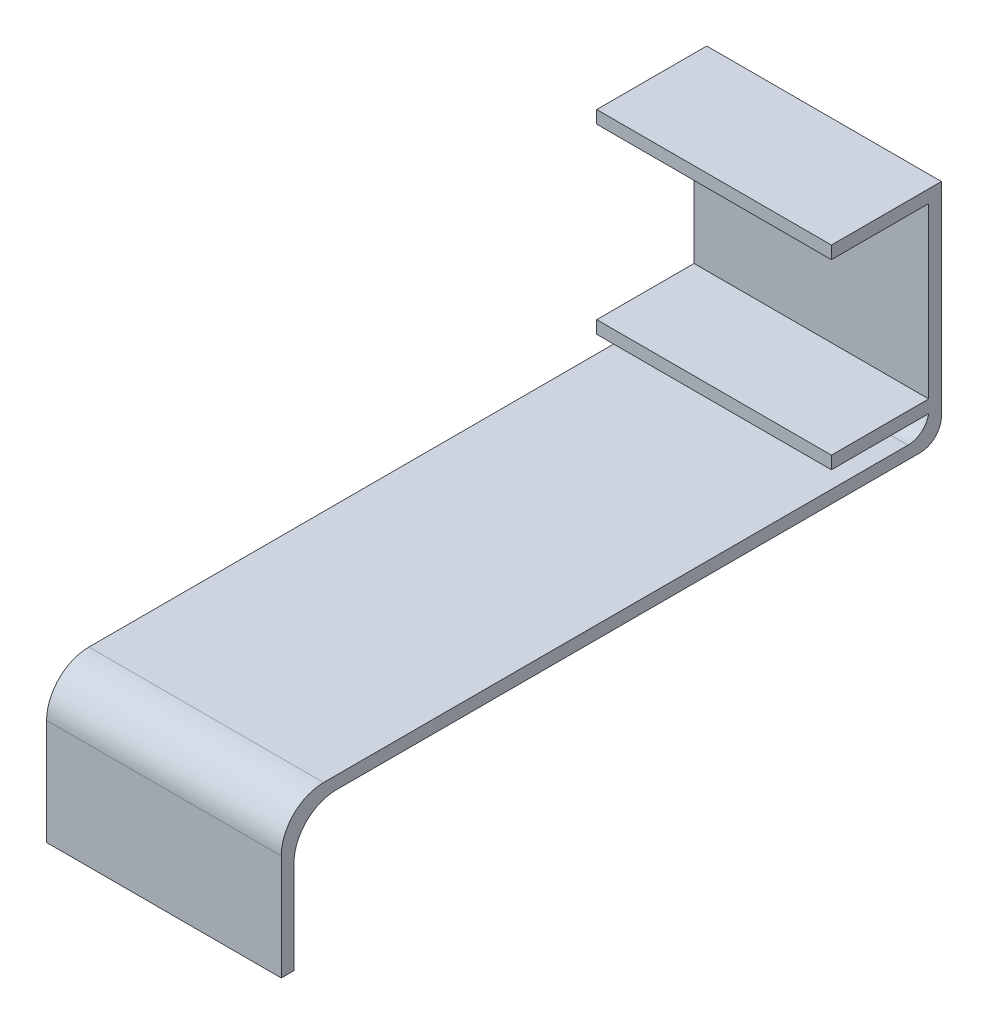
ISO-10303-21;
HEADER;
FILE_DESCRIPTION(('STEP AP214'),'2;1');
FILE_NAME('part.step','',(''),(''),'','','');
FILE_SCHEMA(('AUTOMOTIVE_DESIGN { 1 0 10303 214 1 1 1 1 }'));
ENDSEC;
DATA;
#1=APPLICATION_CONTEXT('core data for automotive mechanical design processes');
#2=APPLICATION_PROTOCOL_DEFINITION('international standard','automotive_design',2000,#1);
#3=PRODUCT_CONTEXT('',#1,'mechanical');
#4=PRODUCT('Part','Part','',(#3));
#5=PRODUCT_RELATED_PRODUCT_CATEGORY('part','',(#4));
#6=PRODUCT_DEFINITION_FORMATION('','',#4);
#7=PRODUCT_DEFINITION_CONTEXT('part definition',#1,'design');
#8=PRODUCT_DEFINITION('design','',#6,#7);
#9=PRODUCT_DEFINITION_SHAPE('','',#8);
#10=(LENGTH_UNIT() NAMED_UNIT(*) SI_UNIT(.MILLI.,.METRE.));
#11=(NAMED_UNIT(*) PLANE_ANGLE_UNIT() SI_UNIT($,.RADIAN.));
#12=(NAMED_UNIT(*) SI_UNIT($,.STERADIAN.) SOLID_ANGLE_UNIT());
#13=UNCERTAINTY_MEASURE_WITH_UNIT(LENGTH_MEASURE(1.E-05),#10,'distance_accuracy_value','');
#14=(GEOMETRIC_REPRESENTATION_CONTEXT(3) GLOBAL_UNCERTAINTY_ASSIGNED_CONTEXT((#13)) GLOBAL_UNIT_ASSIGNED_CONTEXT((#10,
#11,#12)) REPRESENTATION_CONTEXT('',''));
#15=CARTESIAN_POINT('',(0.,0.,0.));
#16=DIRECTION('',(0.,0.,1.));
#17=DIRECTION('',(1.,0.,0.));
#18=AXIS2_PLACEMENT_3D('',#15,#16,#17);
#19=CARTESIAN_POINT('',(0.,0.,3.));
#20=DIRECTION('',(0.,0.,1.));
#21=DIRECTION('',(1.,0.,0.));
#22=AXIS2_PLACEMENT_3D('',#19,#20,#21);
#23=PLANE('',#22);
#24=DIRECTION('',(0.,-1.,0.));
#25=VECTOR('',#24,1.);
#26=CARTESIAN_POINT('',(-27.730505642429,26.5,3.));
#27=LINE('',#26,#25);
#28=CARTESIAN_POINT('',(-27.730505642429,23.5,3.));
#29=VERTEX_POINT('',#28);
#30=CARTESIAN_POINT('',(-27.730505642429,-16.5,3.));
#31=VERTEX_POINT('',#30);
#32=EDGE_CURVE('E241',#29,#31,#27,.T.);
#33=ORIENTED_EDGE('',*,*,#32,.T.);
#34=DIRECTION('',(-1.,0.,0.));
#35=VECTOR('',#34,1.);
#36=CARTESIAN_POINT('',(-27.730505642429,-16.5,3.));
#37=LINE('',#36,#35);
#38=CARTESIAN_POINT('',(27.730505642429,-16.5,3.));
#39=VERTEX_POINT('',#38);
#40=EDGE_CURVE('E200',#39,#31,#37,.T.);
#41=ORIENTED_EDGE('',*,*,#40,.F.);
#42=DIRECTION('',(0.,1.,0.));
#43=VECTOR('',#42,1.);
#44=CARTESIAN_POINT('',(27.730505642429,26.5,3.));
#45=LINE('',#44,#43);
#46=CARTESIAN_POINT('',(27.730505642429,23.5,3.));
#47=VERTEX_POINT('',#46);
#48=EDGE_CURVE('E239',#39,#47,#45,.T.);
#49=ORIENTED_EDGE('',*,*,#48,.T.);
#50=DIRECTION('',(1.,0.,0.));
#51=VECTOR('',#50,1.);
#52=CARTESIAN_POINT('',(-27.730505642429,23.5,3.));
#53=LINE('',#52,#51);
#54=EDGE_CURVE('E218',#29,#47,#53,.T.);
#55=ORIENTED_EDGE('',*,*,#54,.F.);
#56=EDGE_LOOP('',(#33,#41,#49,#55));
#57=FACE_BOUND('',#56,.T.);
#58=ADVANCED_FACE('F36',(#57),#23,.T.);
#59=CARTESIAN_POINT('',(27.730505642429,26.5,3.));
#60=DIRECTION('',(-1.,0.,0.));
#61=DIRECTION('',(0.,-1.,0.));
#62=AXIS2_PLACEMENT_3D('',#59,#60,#61);
#63=PLANE('',#62);
#64=DIRECTION('',(0.,0.,-1.));
#65=VECTOR('',#64,1.);
#66=CARTESIAN_POINT('',(27.730505642429,-26.5,3.));
#67=LINE('',#66,#65);
#68=CARTESIAN_POINT('',(27.730505642429,-26.5,143.));
#69=VERTEX_POINT('',#68);
#70=CARTESIAN_POINT('',(27.730505642429,-26.5,5.));
#71=VERTEX_POINT('',#70);
#72=EDGE_CURVE('E245',#69,#71,#67,.T.);
#73=ORIENTED_EDGE('',*,*,#72,.T.);
#74=CARTESIAN_POINT('',(27.730505642429,-21.5,5.));
#75=DIRECTION('',(-1.,0.,0.));
#76=DIRECTION('',(0.,-1.,0.));
#77=AXIS2_PLACEMENT_3D('',#74,#75,#76);
#78=CIRCLE('',#77,5.);
#79=CARTESIAN_POINT('',(27.730505642429,-21.5,0.));
#80=VERTEX_POINT('',#79);
#81=EDGE_CURVE('E280',#71,#80,#78,.F.);
#82=ORIENTED_EDGE('',*,*,#81,.T.);
#83=DIRECTION('',(0.,1.,0.));
#84=VECTOR('',#83,1.);
#85=CARTESIAN_POINT('',(27.730505642429,26.5,0.));
#86=LINE('',#85,#84);
#87=CARTESIAN_POINT('',(27.730505642429,26.5,0.));
#88=VERTEX_POINT('',#87);
#89=EDGE_CURVE('E238',#80,#88,#86,.T.);
#90=ORIENTED_EDGE('',*,*,#89,.T.);
#91=DIRECTION('',(0.,0.,-1.));
#92=VECTOR('',#91,1.);
#93=CARTESIAN_POINT('',(27.730505642429,26.5,3.));
#94=LINE('',#93,#92);
#95=CARTESIAN_POINT('',(27.730505642429,26.5,26.));
#96=VERTEX_POINT('',#95);
#97=EDGE_CURVE('E258',#96,#88,#94,.T.);
#98=ORIENTED_EDGE('',*,*,#97,.F.);
#99=DIRECTION('',(0.,1.,0.));
#100=VECTOR('',#99,1.);
#101=CARTESIAN_POINT('',(27.730505642429,26.5,26.));
#102=LINE('',#101,#100);
#103=CARTESIAN_POINT('',(27.730505642429,23.5,26.));
#104=VERTEX_POINT('',#103);
#105=EDGE_CURVE('E224',#104,#96,#102,.T.);
#106=ORIENTED_EDGE('',*,*,#105,.F.);
#107=DIRECTION('',(0.,0.,-1.));
#108=VECTOR('',#107,1.);
#109=CARTESIAN_POINT('',(27.730505642429,23.5,26.));
#110=LINE('',#109,#108);
#111=EDGE_CURVE('E230',#104,#47,#110,.T.);
#112=ORIENTED_EDGE('',*,*,#111,.T.);
#113=ORIENTED_EDGE('',*,*,#48,.F.);
#114=DIRECTION('',(0.,0.,-1.));
#115=VECTOR('',#114,1.);
#116=CARTESIAN_POINT('',(27.730505642429,-16.5,26.));
#117=LINE('',#116,#115);
#118=CARTESIAN_POINT('',(27.730505642429,-16.5,26.));
#119=VERTEX_POINT('',#118);
#120=EDGE_CURVE('E211',#119,#39,#117,.T.);
#121=ORIENTED_EDGE('',*,*,#120,.F.);
#122=DIRECTION('',(0.,1.,0.));
#123=VECTOR('',#122,1.);
#124=CARTESIAN_POINT('',(27.730505642429,-16.5,26.));
#125=LINE('',#124,#123);
#126=CARTESIAN_POINT('',(27.730505642429,-19.5,26.));
#127=VERTEX_POINT('',#126);
#128=EDGE_CURVE('E202',#127,#119,#125,.T.);
#129=ORIENTED_EDGE('',*,*,#128,.F.);
#130=DIRECTION('',(0.,0.,-1.));
#131=VECTOR('',#130,1.);
#132=CARTESIAN_POINT('',(27.730505642429,-19.5,26.));
#133=LINE('',#132,#131);
#134=CARTESIAN_POINT('',(27.730505642429,-19.5,3.));
#135=VERTEX_POINT('',#134);
#136=EDGE_CURVE('E213',#127,#135,#133,.T.);
#137=ORIENTED_EDGE('',*,*,#136,.T.);
#138=CARTESIAN_POINT('',(27.730505642429,-18.5,7.89897948556635));
#139=DIRECTION('',(-1.,0.,0.));
#140=DIRECTION('',(0.,-1.,0.));
#141=AXIS2_PLACEMENT_3D('',#138,#139,#140);
#142=CIRCLE('',#141,5.);
#143=CARTESIAN_POINT('',(27.730505642429,-23.5,7.89897948556637));
#144=VERTEX_POINT('',#143);
#145=EDGE_CURVE('E11',#135,#144,#142,.T.);
#146=ORIENTED_EDGE('',*,*,#145,.T.);
#147=DIRECTION('',(0.,0.,-1.));
#148=VECTOR('',#147,1.);
#149=CARTESIAN_POINT('',(27.730505642429,-23.5,153.));
#150=LINE('',#149,#148);
#151=CARTESIAN_POINT('',(27.730505642429,-23.5,146.));
#152=VERTEX_POINT('',#151);
#153=EDGE_CURVE('E193',#152,#144,#150,.T.);
#154=ORIENTED_EDGE('',*,*,#153,.F.);
#155=CARTESIAN_POINT('',(27.730505642429,-33.5,146.));
#156=DIRECTION('',(-1.,0.,0.));
#157=DIRECTION('',(0.,-1.,0.));
#158=AXIS2_PLACEMENT_3D('',#155,#156,#157);
#159=CIRCLE('',#158,10.);
#160=CARTESIAN_POINT('',(27.730505642429,-33.5,156.));
#161=VERTEX_POINT('',#160);
#162=EDGE_CURVE('E275',#152,#161,#159,.F.);
#163=ORIENTED_EDGE('',*,*,#162,.T.);
#164=DIRECTION('',(0.,1.,0.));
#165=VECTOR('',#164,1.);
#166=CARTESIAN_POINT('',(27.730505642429,-23.5,156.));
#167=LINE('',#166,#165);
#168=CARTESIAN_POINT('',(27.730505642429,-58.5,156.));
#169=VERTEX_POINT('',#168);
#170=EDGE_CURVE('E165',#169,#161,#167,.T.);
#171=ORIENTED_EDGE('',*,*,#170,.F.);
#172=DIRECTION('',(0.,0.,-1.));
#173=VECTOR('',#172,1.);
#174=CARTESIAN_POINT('',(27.730505642429,-58.5,156.));
#175=LINE('',#174,#173);
#176=CARTESIAN_POINT('',(27.730505642429,-58.5,153.));
#177=VERTEX_POINT('',#176);
#178=EDGE_CURVE('E176',#169,#177,#175,.T.);
#179=ORIENTED_EDGE('',*,*,#178,.T.);
#180=DIRECTION('',(0.,1.,0.));
#181=VECTOR('',#180,1.);
#182=CARTESIAN_POINT('',(27.730505642429,-23.5,153.));
#183=LINE('',#182,#181);
#184=CARTESIAN_POINT('',(27.730505642429,-36.5,153.));
#185=VERTEX_POINT('',#184);
#186=EDGE_CURVE('E185',#177,#185,#183,.T.);
#187=ORIENTED_EDGE('',*,*,#186,.T.);
#188=CARTESIAN_POINT('',(27.730505642429,-36.5,143.));
#189=DIRECTION('',(-1.,0.,0.));
#190=DIRECTION('',(0.,-1.,0.));
#191=AXIS2_PLACEMENT_3D('',#188,#189,#190);
#192=CIRCLE('',#191,10.);
#193=EDGE_CURVE('E266',#185,#69,#192,.T.);
#194=ORIENTED_EDGE('',*,*,#193,.T.);
#195=EDGE_LOOP('',(#73,#82,#90,#98,#106,#112,#113,#121,#129,#137,#146,#154,#163,#171,#179,#187,#194));
#196=FACE_BOUND('',#195,.T.);
#197=ADVANCED_FACE('F297',(#196),#63,.F.);
#198=CARTESIAN_POINT('',(-27.730505642429,26.5,3.));
#199=DIRECTION('',(0.,-1.,0.));
#200=DIRECTION('',(0.,0.,-1.));
#201=AXIS2_PLACEMENT_3D('',#198,#199,#200);
#202=PLANE('',#201);
#203=DIRECTION('',(-1.,0.,0.));
#204=VECTOR('',#203,1.);
#205=CARTESIAN_POINT('',(-27.730505642429,26.5,0.));
#206=LINE('',#205,#204);
#207=CARTESIAN_POINT('',(-27.730505642429,26.5,0.));
#208=VERTEX_POINT('',#207);
#209=EDGE_CURVE('E247',#88,#208,#206,.T.);
#210=ORIENTED_EDGE('',*,*,#209,.T.);
#211=DIRECTION('',(0.,0.,-1.));
#212=VECTOR('',#211,1.);
#213=CARTESIAN_POINT('',(-27.730505642429,26.5,3.));
#214=LINE('',#213,#212);
#215=CARTESIAN_POINT('',(-27.730505642429,26.5,26.));
#216=VERTEX_POINT('',#215);
#217=EDGE_CURVE('E255',#216,#208,#214,.T.);
#218=ORIENTED_EDGE('',*,*,#217,.F.);
#219=DIRECTION('',(-1.,0.,0.));
#220=VECTOR('',#219,1.);
#221=CARTESIAN_POINT('',(-27.730505642429,26.5,26.));
#222=LINE('',#221,#220);
#223=EDGE_CURVE('E227',#96,#216,#222,.T.);
#224=ORIENTED_EDGE('',*,*,#223,.F.);
#225=ORIENTED_EDGE('',*,*,#97,.T.);
#226=EDGE_LOOP('',(#210,#218,#224,#225));
#227=FACE_BOUND('',#226,.T.);
#228=ADVANCED_FACE('F318',(#227),#202,.F.);
#229=CARTESIAN_POINT('',(-27.730505642429,26.5,3.));
#230=DIRECTION('',(1.,0.,0.));
#231=DIRECTION('',(0.,1.,0.));
#232=AXIS2_PLACEMENT_3D('',#229,#230,#231);
#233=PLANE('',#232);
#234=DIRECTION('',(0.,-1.,0.));
#235=VECTOR('',#234,1.);
#236=CARTESIAN_POINT('',(-27.730505642429,26.5,0.));
#237=LINE('',#236,#235);
#238=CARTESIAN_POINT('',(-27.730505642429,-21.5,0.));
#239=VERTEX_POINT('',#238);
#240=EDGE_CURVE('E242',#208,#239,#237,.T.);
#241=ORIENTED_EDGE('',*,*,#240,.T.);
#242=CARTESIAN_POINT('',(-27.730505642429,-21.5,5.));
#243=DIRECTION('',(1.,0.,0.));
#244=DIRECTION('',(0.,1.,0.));
#245=AXIS2_PLACEMENT_3D('',#242,#243,#244);
#246=CIRCLE('',#245,5.);
#247=CARTESIAN_POINT('',(-27.730505642429,-26.5,5.));
#248=VERTEX_POINT('',#247);
#249=EDGE_CURVE('E284',#239,#248,#246,.F.);
#250=ORIENTED_EDGE('',*,*,#249,.T.);
#251=DIRECTION('',(0.,0.,-1.));
#252=VECTOR('',#251,1.);
#253=CARTESIAN_POINT('',(-27.730505642429,-26.5,3.));
#254=LINE('',#253,#252);
#255=CARTESIAN_POINT('',(-27.730505642429,-26.5,143.));
#256=VERTEX_POINT('',#255);
#257=EDGE_CURVE('E252',#256,#248,#254,.T.);
#258=ORIENTED_EDGE('',*,*,#257,.F.);
#259=CARTESIAN_POINT('',(-27.730505642429,-36.5,143.));
#260=DIRECTION('',(1.,0.,0.));
#261=DIRECTION('',(0.,1.,0.));
#262=AXIS2_PLACEMENT_3D('',#259,#260,#261);
#263=CIRCLE('',#262,10.);
#264=CARTESIAN_POINT('',(-27.730505642429,-36.5,153.));
#265=VERTEX_POINT('',#264);
#266=EDGE_CURVE('E268',#256,#265,#263,.T.);
#267=ORIENTED_EDGE('',*,*,#266,.T.);
#268=DIRECTION('',(0.,-1.,0.));
#269=VECTOR('',#268,1.);
#270=CARTESIAN_POINT('',(-27.730505642429,-23.5,153.));
#271=LINE('',#270,#269);
#272=CARTESIAN_POINT('',(-27.730505642429,-58.5,153.));
#273=VERTEX_POINT('',#272);
#274=EDGE_CURVE('E172',#265,#273,#271,.T.);
#275=ORIENTED_EDGE('',*,*,#274,.T.);
#276=DIRECTION('',(0.,0.,-1.));
#277=VECTOR('',#276,1.);
#278=CARTESIAN_POINT('',(-27.730505642429,-58.5,156.));
#279=LINE('',#278,#277);
#280=CARTESIAN_POINT('',(-27.730505642429,-58.5,156.));
#281=VERTEX_POINT('',#280);
#282=EDGE_CURVE('E168',#281,#273,#279,.T.);
#283=ORIENTED_EDGE('',*,*,#282,.F.);
#284=DIRECTION('',(0.,-1.,0.));
#285=VECTOR('',#284,1.);
#286=CARTESIAN_POINT('',(-27.730505642429,-23.5,156.));
#287=LINE('',#286,#285);
#288=CARTESIAN_POINT('',(-27.730505642429,-33.5,156.));
#289=VERTEX_POINT('',#288);
#290=EDGE_CURVE('E155',#289,#281,#287,.T.);
#291=ORIENTED_EDGE('',*,*,#290,.F.);
#292=CARTESIAN_POINT('',(-27.730505642429,-33.5,146.));
#293=DIRECTION('',(1.,0.,0.));
#294=DIRECTION('',(0.,1.,0.));
#295=AXIS2_PLACEMENT_3D('',#292,#293,#294);
#296=CIRCLE('',#295,10.);
#297=CARTESIAN_POINT('',(-27.730505642429,-23.5,146.));
#298=VERTEX_POINT('',#297);
#299=EDGE_CURVE('E271',#289,#298,#296,.F.);
#300=ORIENTED_EDGE('',*,*,#299,.T.);
#301=DIRECTION('',(0.,0.,-1.));
#302=VECTOR('',#301,1.);
#303=CARTESIAN_POINT('',(-27.730505642429,-23.5,153.));
#304=LINE('',#303,#302);
#305=CARTESIAN_POINT('',(-27.730505642429,-23.5,7.89897948556637));
#306=VERTEX_POINT('',#305);
#307=EDGE_CURVE('E175',#298,#306,#304,.T.);
#308=ORIENTED_EDGE('',*,*,#307,.T.);
#309=CARTESIAN_POINT('',(-27.730505642429,-18.5,7.89897948556635));
#310=DIRECTION('',(1.,0.,0.));
#311=DIRECTION('',(0.,1.,0.));
#312=AXIS2_PLACEMENT_3D('',#309,#310,#311);
#313=CIRCLE('',#312,5.);
#314=CARTESIAN_POINT('',(-27.730505642429,-19.5,3.));
#315=VERTEX_POINT('',#314);
#316=EDGE_CURVE('E44',#306,#315,#313,.T.);
#317=ORIENTED_EDGE('',*,*,#316,.T.);
#318=DIRECTION('',(0.,0.,-1.));
#319=VECTOR('',#318,1.);
#320=CARTESIAN_POINT('',(-27.730505642429,-19.5,26.));
#321=LINE('',#320,#319);
#322=CARTESIAN_POINT('',(-27.730505642429,-19.5,26.));
#323=VERTEX_POINT('',#322);
#324=EDGE_CURVE('E215',#323,#315,#321,.T.);
#325=ORIENTED_EDGE('',*,*,#324,.F.);
#326=DIRECTION('',(0.,-1.,0.));
#327=VECTOR('',#326,1.);
#328=CARTESIAN_POINT('',(-27.730505642429,-16.5,26.));
#329=LINE('',#328,#327);
#330=CARTESIAN_POINT('',(-27.730505642429,-16.5,26.));
#331=VERTEX_POINT('',#330);
#332=EDGE_CURVE('E196',#331,#323,#329,.T.);
#333=ORIENTED_EDGE('',*,*,#332,.F.);
#334=DIRECTION('',(0.,0.,-1.));
#335=VECTOR('',#334,1.);
#336=CARTESIAN_POINT('',(-27.730505642429,-16.5,26.));
#337=LINE('',#336,#335);
#338=EDGE_CURVE('E206',#331,#31,#337,.T.);
#339=ORIENTED_EDGE('',*,*,#338,.T.);
#340=ORIENTED_EDGE('',*,*,#32,.F.);
#341=DIRECTION('',(0.,0.,-1.));
#342=VECTOR('',#341,1.);
#343=CARTESIAN_POINT('',(-27.730505642429,23.5,26.));
#344=LINE('',#343,#342);
#345=CARTESIAN_POINT('',(-27.730505642429,23.5,26.));
#346=VERTEX_POINT('',#345);
#347=EDGE_CURVE('E235',#346,#29,#344,.T.);
#348=ORIENTED_EDGE('',*,*,#347,.F.);
#349=DIRECTION('',(0.,-1.,0.));
#350=VECTOR('',#349,1.);
#351=CARTESIAN_POINT('',(-27.730505642429,26.5,26.));
#352=LINE('',#351,#350);
#353=EDGE_CURVE('E219',#216,#346,#352,.T.);
#354=ORIENTED_EDGE('',*,*,#353,.F.);
#355=ORIENTED_EDGE('',*,*,#217,.T.);
#356=EDGE_LOOP('',(#241,#250,#258,#267,#275,#283,#291,#300,#308,#317,#325,#333,#339,#340,#348,
#354,#355));
#357=FACE_BOUND('',#356,.T.);
#358=ADVANCED_FACE('F170',(#357),#233,.F.);
#359=CARTESIAN_POINT('',(-27.730505642429,-26.5,3.));
#360=DIRECTION('',(0.,1.,0.));
#361=DIRECTION('',(0.,0.,1.));
#362=AXIS2_PLACEMENT_3D('',#359,#360,#361);
#363=PLANE('',#362);
#364=ORIENTED_EDGE('',*,*,#257,.T.);
#365=DIRECTION('',(1.,0.,0.));
#366=VECTOR('',#365,1.);
#367=CARTESIAN_POINT('',(-27.730505642429,-26.5,5.));
#368=LINE('',#367,#366);
#369=EDGE_CURVE('E277',#248,#71,#368,.T.);
#370=ORIENTED_EDGE('',*,*,#369,.T.);
#371=ORIENTED_EDGE('',*,*,#72,.F.);
#372=DIRECTION('',(1.,0.,0.));
#373=VECTOR('',#372,1.);
#374=CARTESIAN_POINT('',(-27.730505642429,-26.5,143.));
#375=LINE('',#374,#373);
#376=EDGE_CURVE('E264',#69,#256,#375,.F.);
#377=ORIENTED_EDGE('',*,*,#376,.T.);
#378=EDGE_LOOP('',(#364,#370,#371,#377));
#379=FACE_BOUND('',#378,.T.);
#380=ADVANCED_FACE('F327',(#379),#363,.F.);
#381=CARTESIAN_POINT('',(0.,0.,0.));
#382=DIRECTION('',(0.,0.,1.));
#383=DIRECTION('',(1.,0.,0.));
#384=AXIS2_PLACEMENT_3D('',#381,#382,#383);
#385=PLANE('',#384);
#386=ORIENTED_EDGE('',*,*,#89,.F.);
#387=DIRECTION('',(1.,0.,0.));
#388=VECTOR('',#387,1.);
#389=CARTESIAN_POINT('',(0.,-21.5,0.));
#390=LINE('',#389,#388);
#391=EDGE_CURVE('E282',#80,#239,#390,.F.);
#392=ORIENTED_EDGE('',*,*,#391,.T.);
#393=ORIENTED_EDGE('',*,*,#240,.F.);
#394=ORIENTED_EDGE('',*,*,#209,.F.);
#395=EDGE_LOOP('',(#386,#392,#393,#394));
#396=FACE_BOUND('',#395,.T.);
#397=ADVANCED_FACE('F324',(#396),#385,.F.);
#398=CARTESIAN_POINT('',(-27.730505642429,23.5,26.));
#399=DIRECTION('',(0.,1.,0.));
#400=DIRECTION('',(0.,0.,1.));
#401=AXIS2_PLACEMENT_3D('',#398,#399,#400);
#402=PLANE('',#401);
#403=ORIENTED_EDGE('',*,*,#54,.T.);
#404=ORIENTED_EDGE('',*,*,#111,.F.);
#405=DIRECTION('',(1.,0.,0.));
#406=VECTOR('',#405,1.);
#407=CARTESIAN_POINT('',(-27.730505642429,23.5,26.));
#408=LINE('',#407,#406);
#409=EDGE_CURVE('E222',#346,#104,#408,.T.);
#410=ORIENTED_EDGE('',*,*,#409,.F.);
#411=ORIENTED_EDGE('',*,*,#347,.T.);
#412=EDGE_LOOP('',(#403,#404,#410,#411));
#413=FACE_BOUND('',#412,.T.);
#414=ADVANCED_FACE('F322',(#413),#402,.F.);
#415=CARTESIAN_POINT('',(0.,0.,26.));
#416=DIRECTION('',(0.,0.,1.));
#417=DIRECTION('',(1.,0.,0.));
#418=AXIS2_PLACEMENT_3D('',#415,#416,#417);
#419=PLANE('',#418);
#420=ORIENTED_EDGE('',*,*,#353,.T.);
#421=ORIENTED_EDGE('',*,*,#409,.T.);
#422=ORIENTED_EDGE('',*,*,#105,.T.);
#423=ORIENTED_EDGE('',*,*,#223,.T.);
#424=EDGE_LOOP('',(#420,#421,#422,#423));
#425=FACE_BOUND('',#424,.T.);
#426=ADVANCED_FACE('F356',(#425),#419,.T.);
#427=CARTESIAN_POINT('',(-27.730505642429,-19.5,26.));
#428=DIRECTION('',(0.,1.,0.));
#429=DIRECTION('',(0.,0.,1.));
#430=AXIS2_PLACEMENT_3D('',#427,#428,#429);
#431=PLANE('',#430);
#432=DIRECTION('',(1.,0.,0.));
#433=VECTOR('',#432,1.);
#434=CARTESIAN_POINT('',(-27.730505642429,-19.5,3.));
#435=LINE('',#434,#433);
#436=EDGE_CURVE('E195',#315,#135,#435,.T.);
#437=ORIENTED_EDGE('',*,*,#436,.T.);
#438=ORIENTED_EDGE('',*,*,#136,.F.);
#439=DIRECTION('',(1.,0.,0.));
#440=VECTOR('',#439,1.);
#441=CARTESIAN_POINT('',(-27.730505642429,-19.5,26.));
#442=LINE('',#441,#440);
#443=EDGE_CURVE('E199',#323,#127,#442,.T.);
#444=ORIENTED_EDGE('',*,*,#443,.F.);
#445=ORIENTED_EDGE('',*,*,#324,.T.);
#446=EDGE_LOOP('',(#437,#438,#444,#445));
#447=FACE_BOUND('',#446,.T.);
#448=ADVANCED_FACE('F291',(#447),#431,.F.);
#449=CARTESIAN_POINT('',(-27.730505642429,-16.5,26.));
#450=DIRECTION('',(0.,-1.,0.));
#451=DIRECTION('',(0.,0.,-1.));
#452=AXIS2_PLACEMENT_3D('',#449,#450,#451);
#453=PLANE('',#452);
#454=ORIENTED_EDGE('',*,*,#40,.T.);
#455=ORIENTED_EDGE('',*,*,#338,.F.);
#456=DIRECTION('',(-1.,0.,0.));
#457=VECTOR('',#456,1.);
#458=CARTESIAN_POINT('',(-27.730505642429,-16.5,26.));
#459=LINE('',#458,#457);
#460=EDGE_CURVE('E204',#119,#331,#459,.T.);
#461=ORIENTED_EDGE('',*,*,#460,.F.);
#462=ORIENTED_EDGE('',*,*,#120,.T.);
#463=EDGE_LOOP('',(#454,#455,#461,#462));
#464=FACE_BOUND('',#463,.T.);
#465=ADVANCED_FACE('F367',(#464),#453,.F.);
#466=CARTESIAN_POINT('',(0.,0.,26.));
#467=DIRECTION('',(0.,0.,1.));
#468=DIRECTION('',(1.,0.,0.));
#469=AXIS2_PLACEMENT_3D('',#466,#467,#468);
#470=PLANE('',#469);
#471=ORIENTED_EDGE('',*,*,#332,.T.);
#472=ORIENTED_EDGE('',*,*,#443,.T.);
#473=ORIENTED_EDGE('',*,*,#128,.T.);
#474=ORIENTED_EDGE('',*,*,#460,.T.);
#475=EDGE_LOOP('',(#471,#472,#473,#474));
#476=FACE_BOUND('',#475,.T.);
#477=ADVANCED_FACE('F369',(#476),#470,.T.);
#478=CARTESIAN_POINT('',(27.730505642429,-23.5,153.));
#479=DIRECTION('',(0.,-1.,0.));
#480=DIRECTION('',(1.,0.,0.));
#481=AXIS2_PLACEMENT_3D('',#478,#479,#480);
#482=PLANE('',#481);
#483=ORIENTED_EDGE('',*,*,#153,.T.);
#484=DIRECTION('',(-1.,0.,0.));
#485=VECTOR('',#484,1.);
#486=CARTESIAN_POINT('',(27.730505642429,-23.5,7.89897948556637));
#487=LINE('',#486,#485);
#488=EDGE_CURVE('E286',#144,#306,#487,.T.);
#489=ORIENTED_EDGE('',*,*,#488,.T.);
#490=ORIENTED_EDGE('',*,*,#307,.F.);
#491=DIRECTION('',(-1.,0.,0.));
#492=VECTOR('',#491,1.);
#493=CARTESIAN_POINT('',(27.730505642429,-23.5,146.));
#494=LINE('',#493,#492);
#495=EDGE_CURVE('E273',#298,#152,#494,.F.);
#496=ORIENTED_EDGE('',*,*,#495,.T.);
#497=EDGE_LOOP('',(#483,#489,#490,#496));
#498=FACE_BOUND('',#497,.T.);
#499=ADVANCED_FACE('F294',(#498),#482,.F.);
#500=CARTESIAN_POINT('',(27.730505642429,-58.5,156.));
#501=DIRECTION('',(0.,1.,0.));
#502=DIRECTION('',(0.,0.,1.));
#503=AXIS2_PLACEMENT_3D('',#500,#501,#502);
#504=PLANE('',#503);
#505=DIRECTION('',(1.,0.,0.));
#506=VECTOR('',#505,1.);
#507=CARTESIAN_POINT('',(27.730505642429,-58.5,153.));
#508=LINE('',#507,#506);
#509=EDGE_CURVE('E189',#273,#177,#508,.T.);
#510=ORIENTED_EDGE('',*,*,#509,.T.);
#511=ORIENTED_EDGE('',*,*,#178,.F.);
#512=DIRECTION('',(1.,0.,0.));
#513=VECTOR('',#512,1.);
#514=CARTESIAN_POINT('',(27.730505642429,-58.5,156.));
#515=LINE('',#514,#513);
#516=EDGE_CURVE('E160',#281,#169,#515,.T.);
#517=ORIENTED_EDGE('',*,*,#516,.F.);
#518=ORIENTED_EDGE('',*,*,#282,.T.);
#519=EDGE_LOOP('',(#510,#511,#517,#518));
#520=FACE_BOUND('',#519,.T.);
#521=ADVANCED_FACE('F178',(#520),#504,.F.);
#522=CARTESIAN_POINT('',(0.,0.,156.));
#523=DIRECTION('',(0.,0.,-1.));
#524=DIRECTION('',(-1.,0.,0.));
#525=AXIS2_PLACEMENT_3D('',#522,#523,#524);
#526=PLANE('',#525);
#527=ORIENTED_EDGE('',*,*,#170,.T.);
#528=DIRECTION('',(-1.,0.,0.));
#529=VECTOR('',#528,1.);
#530=CARTESIAN_POINT('',(0.,-33.5,156.));
#531=LINE('',#530,#529);
#532=EDGE_CURVE('E163',#161,#289,#531,.T.);
#533=ORIENTED_EDGE('',*,*,#532,.T.);
#534=ORIENTED_EDGE('',*,*,#290,.T.);
#535=ORIENTED_EDGE('',*,*,#516,.T.);
#536=EDGE_LOOP('',(#527,#533,#534,#535));
#537=FACE_BOUND('',#536,.T.);
#538=ADVANCED_FACE('F158',(#537),#526,.F.);
#539=CARTESIAN_POINT('',(0.,0.,153.));
#540=DIRECTION('',(0.,0.,-1.));
#541=DIRECTION('',(-1.,0.,0.));
#542=AXIS2_PLACEMENT_3D('',#539,#540,#541);
#543=PLANE('',#542);
#544=ORIENTED_EDGE('',*,*,#274,.F.);
#545=DIRECTION('',(1.,0.,0.));
#546=VECTOR('',#545,1.);
#547=CARTESIAN_POINT('',(0.,-36.5,153.));
#548=LINE('',#547,#546);
#549=EDGE_CURVE('E261',#265,#185,#548,.T.);
#550=ORIENTED_EDGE('',*,*,#549,.T.);
#551=ORIENTED_EDGE('',*,*,#186,.F.);
#552=ORIENTED_EDGE('',*,*,#509,.F.);
#553=EDGE_LOOP('',(#544,#550,#551,#552));
#554=FACE_BOUND('',#553,.T.);
#555=ADVANCED_FACE('F309',(#554),#543,.T.);
#556=CARTESIAN_POINT('',(0.,-36.5,143.));
#557=DIRECTION('',(1.,0.,0.));
#558=DIRECTION('',(0.,0.,-1.));
#559=AXIS2_PLACEMENT_3D('',#556,#557,#558);
#560=CYLINDRICAL_SURFACE('',#559,10.);
#561=ORIENTED_EDGE('',*,*,#266,.F.);
#562=ORIENTED_EDGE('',*,*,#376,.F.);
#563=ORIENTED_EDGE('',*,*,#193,.F.);
#564=ORIENTED_EDGE('',*,*,#549,.F.);
#565=EDGE_LOOP('',(#561,#562,#563,#564));
#566=FACE_BOUND('',#565,.T.);
#567=ADVANCED_FACE('F302',(#566),#560,.F.);
#568=CARTESIAN_POINT('',(0.,-33.5,146.));
#569=DIRECTION('',(-1.,0.,0.));
#570=DIRECTION('',(0.,-1.,0.));
#571=AXIS2_PLACEMENT_3D('',#568,#569,#570);
#572=CYLINDRICAL_SURFACE('',#571,10.);
#573=ORIENTED_EDGE('',*,*,#162,.F.);
#574=ORIENTED_EDGE('',*,*,#495,.F.);
#575=ORIENTED_EDGE('',*,*,#299,.F.);
#576=ORIENTED_EDGE('',*,*,#532,.F.);
#577=EDGE_LOOP('',(#573,#574,#575,#576));
#578=FACE_BOUND('',#577,.T.);
#579=ADVANCED_FACE('F299',(#578),#572,.T.);
#580=CARTESIAN_POINT('',(-27.730505642429,-21.5,5.));
#581=DIRECTION('',(1.,0.,0.));
#582=DIRECTION('',(0.,0.,-1.));
#583=AXIS2_PLACEMENT_3D('',#580,#581,#582);
#584=CYLINDRICAL_SURFACE('',#583,5.);
#585=ORIENTED_EDGE('',*,*,#249,.F.);
#586=ORIENTED_EDGE('',*,*,#391,.F.);
#587=ORIENTED_EDGE('',*,*,#81,.F.);
#588=ORIENTED_EDGE('',*,*,#369,.F.);
#589=EDGE_LOOP('',(#585,#586,#587,#588));
#590=FACE_BOUND('',#589,.T.);
#591=ADVANCED_FACE('F301',(#590),#584,.T.);
#592=CARTESIAN_POINT('',(0.,-18.5,7.89897948556635));
#593=DIRECTION('',(-1.,0.,0.));
#594=DIRECTION('',(0.,0.,1.));
#595=AXIS2_PLACEMENT_3D('',#592,#593,#594);
#596=CYLINDRICAL_SURFACE('',#595,5.);
#597=ORIENTED_EDGE('',*,*,#145,.F.);
#598=ORIENTED_EDGE('',*,*,#436,.F.);
#599=ORIENTED_EDGE('',*,*,#316,.F.);
#600=ORIENTED_EDGE('',*,*,#488,.F.);
#601=EDGE_LOOP('',(#597,#598,#599,#600));
#602=FACE_BOUND('',#601,.T.);
#603=ADVANCED_FACE('F38',(#602),#596,.F.);
#604=CLOSED_SHELL('',(#58,#197,#228,#358,#380,#397,#414,#426,#448,#465,#477,#499,#521,#538,#555,
#567,#579,#591,#603));
#605=MANIFOLD_SOLID_BREP('B2',#604);
#606=ADVANCED_BREP_SHAPE_REPRESENTATION('',(#18,#605),#14);
#607=SHAPE_DEFINITION_REPRESENTATION(#9,#606);
ENDSEC;
END-ISO-10303-21;
